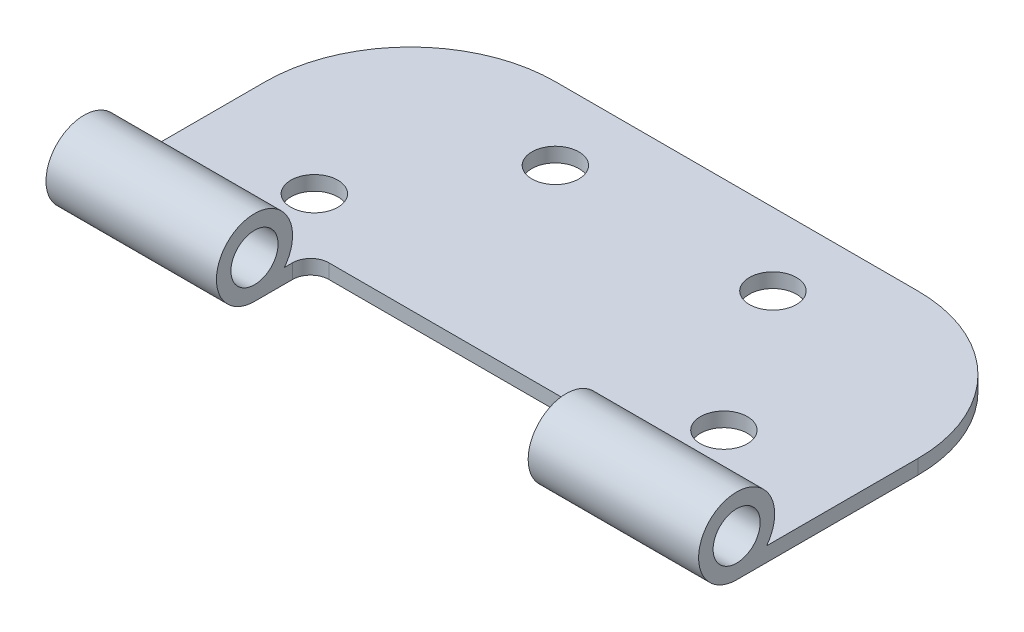
ISO-10303-21;
HEADER;
FILE_DESCRIPTION(('STEP AP214'),'2;1');
FILE_NAME('part.step','',(''),(''),'','','');
FILE_SCHEMA(('AUTOMOTIVE_DESIGN { 1 0 10303 214 1 1 1 1 }'));
ENDSEC;
DATA;
#1=APPLICATION_CONTEXT('core data for automotive mechanical design processes');
#2=APPLICATION_PROTOCOL_DEFINITION('international standard','automotive_design',2000,#1);
#3=PRODUCT_CONTEXT('',#1,'mechanical');
#4=PRODUCT('Part','Part','',(#3));
#5=PRODUCT_RELATED_PRODUCT_CATEGORY('part','',(#4));
#6=PRODUCT_DEFINITION_FORMATION('','',#4);
#7=PRODUCT_DEFINITION_CONTEXT('part definition',#1,'design');
#8=PRODUCT_DEFINITION('design','',#6,#7);
#9=PRODUCT_DEFINITION_SHAPE('','',#8);
#10=(LENGTH_UNIT() NAMED_UNIT(*) SI_UNIT(.MILLI.,.METRE.));
#11=(NAMED_UNIT(*) PLANE_ANGLE_UNIT() SI_UNIT($,.RADIAN.));
#12=(NAMED_UNIT(*) SI_UNIT($,.STERADIAN.) SOLID_ANGLE_UNIT());
#13=UNCERTAINTY_MEASURE_WITH_UNIT(LENGTH_MEASURE(1.E-05),#10,'distance_accuracy_value','');
#14=(GEOMETRIC_REPRESENTATION_CONTEXT(3) GLOBAL_UNCERTAINTY_ASSIGNED_CONTEXT((#13)) GLOBAL_UNIT_ASSIGNED_CONTEXT((#10,
#11,#12)) REPRESENTATION_CONTEXT('',''));
#15=CARTESIAN_POINT('',(0.,0.,0.));
#16=DIRECTION('',(0.,0.,1.));
#17=DIRECTION('',(1.,0.,0.));
#18=AXIS2_PLACEMENT_3D('',#15,#16,#17);
#19=CARTESIAN_POINT('',(-59.8492424049175,5.25,22.5));
#20=DIRECTION('',(1.,0.,0.));
#21=DIRECTION('',(0.,0.,-1.));
#22=AXIS2_PLACEMENT_3D('',#19,#20,#21);
#23=CYLINDRICAL_SURFACE('',#22,5.25);
#24=CARTESIAN_POINT('',(21.495,5.25,22.5));
#25=DIRECTION('',(1.,0.,0.));
#26=DIRECTION('',(0.,0.,-1.));
#27=AXIS2_PLACEMENT_3D('',#24,#25,#26);
#28=CIRCLE('',#27,5.25);
#29=CARTESIAN_POINT('',(21.495,0.,22.5));
#30=VERTEX_POINT('',#29);
#31=CARTESIAN_POINT('',(21.495,2.,18.3768943743823));
#32=VERTEX_POINT('',#31);
#33=EDGE_CURVE('E175',#30,#32,#28,.F.);
#34=ORIENTED_EDGE('',*,*,#33,.F.);
#35=DIRECTION('',(1.,0.,0.));
#36=VECTOR('',#35,1.);
#37=CARTESIAN_POINT('',(-45.,0.,22.5));
#38=LINE('',#37,#36);
#39=CARTESIAN_POINT('',(45.,0.,22.5));
#40=VERTEX_POINT('',#39);
#41=EDGE_CURVE('E159',#30,#40,#38,.T.);
#42=ORIENTED_EDGE('',*,*,#41,.T.);
#43=CARTESIAN_POINT('',(45.,5.25,22.5));
#44=DIRECTION('',(1.,0.,0.));
#45=DIRECTION('',(0.,0.,-1.));
#46=AXIS2_PLACEMENT_3D('',#43,#44,#45);
#47=CIRCLE('',#46,5.25);
#48=CARTESIAN_POINT('',(45.,2.,18.3768943743823));
#49=VERTEX_POINT('',#48);
#50=EDGE_CURVE('E195',#49,#40,#47,.T.);
#51=ORIENTED_EDGE('',*,*,#50,.F.);
#52=DIRECTION('',(1.,0.,0.));
#53=VECTOR('',#52,1.);
#54=CARTESIAN_POINT('',(-59.8492424049175,2.,18.3768943743824));
#55=LINE('',#54,#53);
#56=EDGE_CURVE('E56',#49,#32,#55,.F.);
#57=ORIENTED_EDGE('',*,*,#56,.T.);
#58=EDGE_LOOP('',(#34,#42,#51,#57));
#59=FACE_BOUND('',#58,.T.);
#60=ADVANCED_FACE('F39',(#59),#23,.T.);
#61=CARTESIAN_POINT('',(-59.8492424049175,5.25,22.5));
#62=DIRECTION('',(1.,0.,0.));
#63=DIRECTION('',(0.,0.,-1.));
#64=AXIS2_PLACEMENT_3D('',#61,#62,#63);
#65=CYLINDRICAL_SURFACE('',#64,3.25);
#66=CARTESIAN_POINT('',(-21.495,5.25,22.5));
#67=DIRECTION('',(-1.,0.,0.));
#68=DIRECTION('',(0.,0.,1.));
#69=AXIS2_PLACEMENT_3D('',#66,#67,#68);
#70=CIRCLE('',#69,3.25);
#71=CARTESIAN_POINT('',(-21.495,5.25,25.75));
#72=VERTEX_POINT('',#71);
#73=EDGE_CURVE('E43',#72,#72,#70,.F.);
#74=ORIENTED_EDGE('',*,*,#73,.T.);
#75=EDGE_LOOP('',(#74));
#76=FACE_BOUND('',#75,.T.);
#77=CARTESIAN_POINT('',(-45.,5.25,22.5));
#78=DIRECTION('',(1.,0.,0.));
#79=DIRECTION('',(0.,0.,-1.));
#80=AXIS2_PLACEMENT_3D('',#77,#78,#79);
#81=CIRCLE('',#80,3.25);
#82=CARTESIAN_POINT('',(-45.,5.25,19.25));
#83=VERTEX_POINT('',#82);
#84=EDGE_CURVE('E192',#83,#83,#81,.F.);
#85=ORIENTED_EDGE('',*,*,#84,.T.);
#86=EDGE_LOOP('',(#85));
#87=FACE_BOUND('',#86,.T.);
#88=ADVANCED_FACE('F277',(#76,#87),#65,.F.);
#89=CARTESIAN_POINT('',(-25.,2.,-2.50000000000001));
#90=DIRECTION('',(0.,1.,0.));
#91=DIRECTION('',(0.,0.,1.));
#92=AXIS2_PLACEMENT_3D('',#89,#90,#91);
#93=PLANE('',#92);
#94=DIRECTION('',(0.,0.,1.));
#95=VECTOR('',#94,1.);
#96=CARTESIAN_POINT('',(-21.495,2.,-2.50000000000001));
#97=LINE('',#96,#95);
#98=CARTESIAN_POINT('',(-21.495,2.,17.25));
#99=VERTEX_POINT('',#98);
#100=CARTESIAN_POINT('',(-21.495,2.,18.3768943743824));
#101=VERTEX_POINT('',#100);
#102=EDGE_CURVE('E180',#99,#101,#97,.T.);
#103=ORIENTED_EDGE('',*,*,#102,.F.);
#104=CARTESIAN_POINT('',(-18.995,2.,17.25));
#105=DIRECTION('',(0.,1.,0.));
#106=DIRECTION('',(0.,0.,1.));
#107=AXIS2_PLACEMENT_3D('',#104,#105,#106);
#108=CIRCLE('',#107,2.5);
#109=CARTESIAN_POINT('',(-18.995,2.,14.75));
#110=VERTEX_POINT('',#109);
#111=EDGE_CURVE('E184',#110,#99,#108,.T.);
#112=ORIENTED_EDGE('',*,*,#111,.F.);
#113=DIRECTION('',(-1.,0.,0.));
#114=VECTOR('',#113,1.);
#115=CARTESIAN_POINT('',(-25.,2.,14.75));
#116=LINE('',#115,#114);
#117=CARTESIAN_POINT('',(18.995,2.,14.75));
#118=VERTEX_POINT('',#117);
#119=EDGE_CURVE('E186',#118,#110,#116,.T.);
#120=ORIENTED_EDGE('',*,*,#119,.F.);
#121=CARTESIAN_POINT('',(18.995,2.,17.25));
#122=DIRECTION('',(0.,1.,0.));
#123=DIRECTION('',(0.,0.,1.));
#124=AXIS2_PLACEMENT_3D('',#121,#122,#123);
#125=CIRCLE('',#124,2.5);
#126=CARTESIAN_POINT('',(21.495,2.,17.25));
#127=VERTEX_POINT('',#126);
#128=EDGE_CURVE('E182',#127,#118,#125,.T.);
#129=ORIENTED_EDGE('',*,*,#128,.F.);
#130=DIRECTION('',(0.,0.,-1.));
#131=VECTOR('',#130,1.);
#132=CARTESIAN_POINT('',(21.495,2.,-2.5));
#133=LINE('',#132,#131);
#134=EDGE_CURVE('E140',#32,#127,#133,.T.);
#135=ORIENTED_EDGE('',*,*,#134,.F.);
#136=ORIENTED_EDGE('',*,*,#56,.F.);
#137=DIRECTION('',(0.,0.,-1.));
#138=VECTOR('',#137,1.);
#139=CARTESIAN_POINT('',(45.,2.,-2.49999999999986));
#140=LINE('',#139,#138);
#141=CARTESIAN_POINT('',(45.,2.,-2.49999999999986));
#142=VERTEX_POINT('',#141);
#143=EDGE_CURVE('E226',#49,#142,#140,.T.);
#144=ORIENTED_EDGE('',*,*,#143,.T.);
#145=CARTESIAN_POINT('',(25.,2.,-2.5));
#146=DIRECTION('',(0.,1.,0.));
#147=DIRECTION('',(0.,0.,1.));
#148=AXIS2_PLACEMENT_3D('',#145,#146,#147);
#149=CIRCLE('',#148,20.);
#150=CARTESIAN_POINT('',(24.9999999999999,2.,-22.5));
#151=VERTEX_POINT('',#150);
#152=EDGE_CURVE('E228',#142,#151,#149,.T.);
#153=ORIENTED_EDGE('',*,*,#152,.T.);
#154=DIRECTION('',(-1.,0.,0.));
#155=VECTOR('',#154,1.);
#156=CARTESIAN_POINT('',(-24.9999999999999,2.,-22.5));
#157=LINE('',#156,#155);
#158=CARTESIAN_POINT('',(-24.9999999999999,2.,-22.5));
#159=VERTEX_POINT('',#158);
#160=EDGE_CURVE('E231',#151,#159,#157,.T.);
#161=ORIENTED_EDGE('',*,*,#160,.T.);
#162=CARTESIAN_POINT('',(-25.,2.,-2.50000000000001));
#163=DIRECTION('',(0.,1.,0.));
#164=DIRECTION('',(0.,0.,1.));
#165=AXIS2_PLACEMENT_3D('',#162,#163,#164);
#166=CIRCLE('',#165,20.);
#167=CARTESIAN_POINT('',(-45.,2.,-2.49999999999986));
#168=VERTEX_POINT('',#167);
#169=EDGE_CURVE('E233',#159,#168,#166,.T.);
#170=ORIENTED_EDGE('',*,*,#169,.T.);
#171=DIRECTION('',(0.,0.,1.));
#172=VECTOR('',#171,1.);
#173=CARTESIAN_POINT('',(-45.,2.,-2.49999999999986));
#174=LINE('',#173,#172);
#175=CARTESIAN_POINT('',(-45.,2.,18.3768943743824));
#176=VERTEX_POINT('',#175);
#177=EDGE_CURVE('E235',#168,#176,#174,.T.);
#178=ORIENTED_EDGE('',*,*,#177,.T.);
#179=EDGE_CURVE('E64',#101,#176,#55,.F.);
#180=ORIENTED_EDGE('',*,*,#179,.F.);
#181=EDGE_LOOP('',(#103,#112,#120,#129,#135,#136,#144,#153,#161,#170,#178,#180));
#182=FACE_BOUND('',#181,.T.);
#183=CARTESIAN_POINT('',(15.,2.,-12.5));
#184=DIRECTION('',(0.,1.,0.));
#185=DIRECTION('',(0.,0.,-1.));
#186=AXIS2_PLACEMENT_3D('',#183,#184,#185);
#187=CIRCLE('',#186,3.24);
#188=CARTESIAN_POINT('',(15.,2.,-15.74));
#189=VERTEX_POINT('',#188);
#190=EDGE_CURVE('E208',#189,#189,#187,.T.);
#191=ORIENTED_EDGE('',*,*,#190,.F.);
#192=EDGE_LOOP('',(#191));
#193=FACE_BOUND('',#192,.T.);
#194=CARTESIAN_POINT('',(-28.24,2.,7.5));
#195=DIRECTION('',(0.,1.,0.));
#196=DIRECTION('',(0.,0.,1.));
#197=AXIS2_PLACEMENT_3D('',#194,#195,#196);
#198=CIRCLE('',#197,3.24);
#199=CARTESIAN_POINT('',(-28.24,2.,10.74));
#200=VERTEX_POINT('',#199);
#201=EDGE_CURVE('E220',#200,#200,#198,.T.);
#202=ORIENTED_EDGE('',*,*,#201,.F.);
#203=EDGE_LOOP('',(#202));
#204=FACE_BOUND('',#203,.T.);
#205=CARTESIAN_POINT('',(-15.,2.,-12.5));
#206=DIRECTION('',(0.,1.,0.));
#207=DIRECTION('',(0.,0.,1.));
#208=AXIS2_PLACEMENT_3D('',#205,#206,#207);
#209=CIRCLE('',#208,3.24);
#210=CARTESIAN_POINT('',(-15.,2.,-9.26));
#211=VERTEX_POINT('',#210);
#212=EDGE_CURVE('E214',#211,#211,#209,.T.);
#213=ORIENTED_EDGE('',*,*,#212,.F.);
#214=EDGE_LOOP('',(#213));
#215=FACE_BOUND('',#214,.T.);
#216=CARTESIAN_POINT('',(28.24,2.,7.49999999999999));
#217=DIRECTION('',(0.,1.,0.));
#218=DIRECTION('',(0.,0.,-1.));
#219=AXIS2_PLACEMENT_3D('',#216,#217,#218);
#220=CIRCLE('',#219,3.24);
#221=CARTESIAN_POINT('',(28.24,2.,4.25999999999999));
#222=VERTEX_POINT('',#221);
#223=EDGE_CURVE('E202',#222,#222,#220,.T.);
#224=ORIENTED_EDGE('',*,*,#223,.F.);
#225=EDGE_LOOP('',(#224));
#226=FACE_BOUND('',#225,.T.);
#227=ADVANCED_FACE('F285',(#182,#193,#204,#215,#226),#93,.T.);
#228=CARTESIAN_POINT('',(-25.,0.,-2.50000000000001));
#229=DIRECTION('',(0.,1.,0.));
#230=DIRECTION('',(0.,0.,1.));
#231=AXIS2_PLACEMENT_3D('',#228,#229,#230);
#232=PLANE('',#231);
#233=CARTESIAN_POINT('',(-18.995,0.,17.25));
#234=DIRECTION('',(0.,1.,0.));
#235=DIRECTION('',(0.,0.,-1.));
#236=AXIS2_PLACEMENT_3D('',#233,#234,#235);
#237=CIRCLE('',#236,2.5);
#238=CARTESIAN_POINT('',(-18.995,0.,14.75));
#239=VERTEX_POINT('',#238);
#240=CARTESIAN_POINT('',(-21.495,0.,17.25));
#241=VERTEX_POINT('',#240);
#242=EDGE_CURVE('E144',#239,#241,#237,.T.);
#243=ORIENTED_EDGE('',*,*,#242,.T.);
#244=DIRECTION('',(0.,0.,1.));
#245=VECTOR('',#244,1.);
#246=CARTESIAN_POINT('',(-21.495,0.,40.75));
#247=LINE('',#246,#245);
#248=CARTESIAN_POINT('',(-21.495,0.,22.5));
#249=VERTEX_POINT('',#248);
#250=EDGE_CURVE('E160',#241,#249,#247,.T.);
#251=ORIENTED_EDGE('',*,*,#250,.T.);
#252=CARTESIAN_POINT('',(-45.,0.,22.5));
#253=VERTEX_POINT('',#252);
#254=EDGE_CURVE('E229',#253,#249,#38,.T.);
#255=ORIENTED_EDGE('',*,*,#254,.F.);
#256=DIRECTION('',(0.,0.,1.));
#257=VECTOR('',#256,1.);
#258=CARTESIAN_POINT('',(-45.,0.,-2.49999999999986));
#259=LINE('',#258,#257);
#260=CARTESIAN_POINT('',(-45.,0.,-2.49999999999986));
#261=VERTEX_POINT('',#260);
#262=EDGE_CURVE('E246',#261,#253,#259,.T.);
#263=ORIENTED_EDGE('',*,*,#262,.F.);
#264=CARTESIAN_POINT('',(-25.,0.,-2.50000000000001));
#265=DIRECTION('',(0.,1.,0.));
#266=DIRECTION('',(0.,0.,1.));
#267=AXIS2_PLACEMENT_3D('',#264,#265,#266);
#268=CIRCLE('',#267,20.);
#269=CARTESIAN_POINT('',(-24.9999999999999,0.,-22.5));
#270=VERTEX_POINT('',#269);
#271=EDGE_CURVE('E244',#270,#261,#268,.T.);
#272=ORIENTED_EDGE('',*,*,#271,.F.);
#273=DIRECTION('',(-1.,0.,0.));
#274=VECTOR('',#273,1.);
#275=CARTESIAN_POINT('',(-24.9999999999999,0.,-22.5));
#276=LINE('',#275,#274);
#277=CARTESIAN_POINT('',(24.9999999999999,0.,-22.5));
#278=VERTEX_POINT('',#277);
#279=EDGE_CURVE('E242',#278,#270,#276,.T.);
#280=ORIENTED_EDGE('',*,*,#279,.F.);
#281=CARTESIAN_POINT('',(25.,0.,-2.5));
#282=DIRECTION('',(0.,1.,0.));
#283=DIRECTION('',(0.,0.,1.));
#284=AXIS2_PLACEMENT_3D('',#281,#282,#283);
#285=CIRCLE('',#284,20.);
#286=CARTESIAN_POINT('',(45.,0.,-2.49999999999986));
#287=VERTEX_POINT('',#286);
#288=EDGE_CURVE('E240',#287,#278,#285,.T.);
#289=ORIENTED_EDGE('',*,*,#288,.F.);
#290=DIRECTION('',(0.,0.,-1.));
#291=VECTOR('',#290,1.);
#292=CARTESIAN_POINT('',(45.,0.,-2.49999999999986));
#293=LINE('',#292,#291);
#294=EDGE_CURVE('E223',#40,#287,#293,.T.);
#295=ORIENTED_EDGE('',*,*,#294,.F.);
#296=ORIENTED_EDGE('',*,*,#41,.F.);
#297=DIRECTION('',(0.,0.,-1.));
#298=VECTOR('',#297,1.);
#299=CARTESIAN_POINT('',(21.495,0.,40.75));
#300=LINE('',#299,#298);
#301=CARTESIAN_POINT('',(21.495,0.,17.25));
#302=VERTEX_POINT('',#301);
#303=EDGE_CURVE('E138',#30,#302,#300,.T.);
#304=ORIENTED_EDGE('',*,*,#303,.T.);
#305=CARTESIAN_POINT('',(18.995,0.,17.25));
#306=DIRECTION('',(0.,1.,0.));
#307=DIRECTION('',(0.,0.,1.));
#308=AXIS2_PLACEMENT_3D('',#305,#306,#307);
#309=CIRCLE('',#308,2.5);
#310=CARTESIAN_POINT('',(18.995,0.,14.75));
#311=VERTEX_POINT('',#310);
#312=EDGE_CURVE('E147',#302,#311,#309,.T.);
#313=ORIENTED_EDGE('',*,*,#312,.T.);
#314=DIRECTION('',(-1.,0.,0.));
#315=VECTOR('',#314,1.);
#316=CARTESIAN_POINT('',(-18.995,0.,14.75));
#317=LINE('',#316,#315);
#318=EDGE_CURVE('E153',#311,#239,#317,.T.);
#319=ORIENTED_EDGE('',*,*,#318,.T.);
#320=EDGE_LOOP('',(#243,#251,#255,#263,#272,#280,#289,#295,#296,#304,#313,#319));
#321=FACE_BOUND('',#320,.T.);
#322=CARTESIAN_POINT('',(-28.24,0.,7.5));
#323=DIRECTION('',(0.,1.,0.));
#324=DIRECTION('',(0.,0.,1.));
#325=AXIS2_PLACEMENT_3D('',#322,#323,#324);
#326=CIRCLE('',#325,3.24);
#327=CARTESIAN_POINT('',(-28.24,0.,10.74));
#328=VERTEX_POINT('',#327);
#329=EDGE_CURVE('E217',#328,#328,#326,.T.);
#330=ORIENTED_EDGE('',*,*,#329,.T.);
#331=EDGE_LOOP('',(#330));
#332=FACE_BOUND('',#331,.T.);
#333=CARTESIAN_POINT('',(-15.,0.,-12.5));
#334=DIRECTION('',(0.,1.,0.));
#335=DIRECTION('',(0.,0.,1.));
#336=AXIS2_PLACEMENT_3D('',#333,#334,#335);
#337=CIRCLE('',#336,3.24);
#338=CARTESIAN_POINT('',(-15.,0.,-9.26));
#339=VERTEX_POINT('',#338);
#340=EDGE_CURVE('E211',#339,#339,#337,.T.);
#341=ORIENTED_EDGE('',*,*,#340,.T.);
#342=EDGE_LOOP('',(#341));
#343=FACE_BOUND('',#342,.T.);
#344=CARTESIAN_POINT('',(15.,0.,-12.5));
#345=DIRECTION('',(0.,1.,0.));
#346=DIRECTION('',(0.,0.,-1.));
#347=AXIS2_PLACEMENT_3D('',#344,#345,#346);
#348=CIRCLE('',#347,3.24);
#349=CARTESIAN_POINT('',(15.,0.,-15.74));
#350=VERTEX_POINT('',#349);
#351=EDGE_CURVE('E205',#350,#350,#348,.T.);
#352=ORIENTED_EDGE('',*,*,#351,.T.);
#353=EDGE_LOOP('',(#352));
#354=FACE_BOUND('',#353,.T.);
#355=CARTESIAN_POINT('',(28.24,0.,7.49999999999999));
#356=DIRECTION('',(0.,1.,0.));
#357=DIRECTION('',(0.,0.,-1.));
#358=AXIS2_PLACEMENT_3D('',#355,#356,#357);
#359=CIRCLE('',#358,3.24);
#360=CARTESIAN_POINT('',(28.24,0.,4.25999999999999));
#361=VERTEX_POINT('',#360);
#362=EDGE_CURVE('E201',#361,#361,#359,.T.);
#363=ORIENTED_EDGE('',*,*,#362,.T.);
#364=EDGE_LOOP('',(#363));
#365=FACE_BOUND('',#364,.T.);
#366=ADVANCED_FACE('F156',(#321,#332,#343,#354,#365),#232,.F.);
#367=CARTESIAN_POINT('',(45.,2.,-2.49999999999986));
#368=DIRECTION('',(-1.,0.,0.));
#369=DIRECTION('',(0.,0.,1.));
#370=AXIS2_PLACEMENT_3D('',#367,#368,#369);
#371=PLANE('',#370);
#372=ORIENTED_EDGE('',*,*,#143,.F.);
#373=ORIENTED_EDGE('',*,*,#50,.T.);
#374=ORIENTED_EDGE('',*,*,#294,.T.);
#375=DIRECTION('',(0.,-1.,0.));
#376=VECTOR('',#375,1.);
#377=CARTESIAN_POINT('',(45.,2.,-2.49999999999986));
#378=LINE('',#377,#376);
#379=EDGE_CURVE('E11',#142,#287,#378,.T.);
#380=ORIENTED_EDGE('',*,*,#379,.F.);
#381=EDGE_LOOP('',(#372,#373,#374,#380));
#382=FACE_BOUND('',#381,.T.);
#383=CARTESIAN_POINT('',(45.,5.25,22.5));
#384=DIRECTION('',(1.,0.,0.));
#385=DIRECTION('',(0.,0.,-1.));
#386=AXIS2_PLACEMENT_3D('',#383,#384,#385);
#387=CIRCLE('',#386,3.25);
#388=CARTESIAN_POINT('',(45.,5.25,19.25));
#389=VERTEX_POINT('',#388);
#390=EDGE_CURVE('E188',#389,#389,#387,.T.);
#391=ORIENTED_EDGE('',*,*,#390,.F.);
#392=EDGE_LOOP('',(#391));
#393=FACE_BOUND('',#392,.T.);
#394=ADVANCED_FACE('F41',(#382,#393),#371,.F.);
#395=CARTESIAN_POINT('',(25.,2.,-2.5));
#396=DIRECTION('',(0.,-1.,0.));
#397=DIRECTION('',(0.,0.,-1.));
#398=AXIS2_PLACEMENT_3D('',#395,#396,#397);
#399=CYLINDRICAL_SURFACE('',#398,20.);
#400=ORIENTED_EDGE('',*,*,#288,.T.);
#401=DIRECTION('',(0.,-1.,0.));
#402=VECTOR('',#401,1.);
#403=CARTESIAN_POINT('',(24.9999999999999,2.,-22.5));
#404=LINE('',#403,#402);
#405=EDGE_CURVE('E48',#151,#278,#404,.T.);
#406=ORIENTED_EDGE('',*,*,#405,.F.);
#407=ORIENTED_EDGE('',*,*,#152,.F.);
#408=ORIENTED_EDGE('',*,*,#379,.T.);
#409=EDGE_LOOP('',(#400,#406,#407,#408));
#410=FACE_BOUND('',#409,.T.);
#411=ADVANCED_FACE('F385',(#410),#399,.T.);
#412=CARTESIAN_POINT('',(-24.9999999999999,2.,-22.5));
#413=DIRECTION('',(0.,0.,1.));
#414=DIRECTION('',(1.,0.,0.));
#415=AXIS2_PLACEMENT_3D('',#412,#413,#414);
#416=PLANE('',#415);
#417=ORIENTED_EDGE('',*,*,#279,.T.);
#418=DIRECTION('',(0.,-1.,0.));
#419=VECTOR('',#418,1.);
#420=CARTESIAN_POINT('',(-24.9999999999999,2.,-22.5));
#421=LINE('',#420,#419);
#422=EDGE_CURVE('E253',#159,#270,#421,.T.);
#423=ORIENTED_EDGE('',*,*,#422,.F.);
#424=ORIENTED_EDGE('',*,*,#160,.F.);
#425=ORIENTED_EDGE('',*,*,#405,.T.);
#426=EDGE_LOOP('',(#417,#423,#424,#425));
#427=FACE_BOUND('',#426,.T.);
#428=ADVANCED_FACE('F427',(#427),#416,.F.);
#429=CARTESIAN_POINT('',(-25.,2.,-2.50000000000001));
#430=DIRECTION('',(0.,-1.,0.));
#431=DIRECTION('',(0.,0.,-1.));
#432=AXIS2_PLACEMENT_3D('',#429,#430,#431);
#433=CYLINDRICAL_SURFACE('',#432,20.);
#434=ORIENTED_EDGE('',*,*,#271,.T.);
#435=DIRECTION('',(0.,-1.,0.));
#436=VECTOR('',#435,1.);
#437=CARTESIAN_POINT('',(-45.,2.,-2.49999999999986));
#438=LINE('',#437,#436);
#439=EDGE_CURVE('E237',#168,#261,#438,.T.);
#440=ORIENTED_EDGE('',*,*,#439,.F.);
#441=ORIENTED_EDGE('',*,*,#169,.F.);
#442=ORIENTED_EDGE('',*,*,#422,.T.);
#443=EDGE_LOOP('',(#434,#440,#441,#442));
#444=FACE_BOUND('',#443,.T.);
#445=ADVANCED_FACE('F372',(#444),#433,.T.);
#446=CARTESIAN_POINT('',(-45.,2.,-2.49999999999986));
#447=DIRECTION('',(1.,0.,0.));
#448=DIRECTION('',(0.,0.,-1.));
#449=AXIS2_PLACEMENT_3D('',#446,#447,#448);
#450=PLANE('',#449);
#451=CARTESIAN_POINT('',(-45.,5.25,22.5));
#452=DIRECTION('',(1.,0.,0.));
#453=DIRECTION('',(0.,0.,-1.));
#454=AXIS2_PLACEMENT_3D('',#451,#452,#453);
#455=CIRCLE('',#454,5.25);
#456=EDGE_CURVE('E189',#253,#176,#455,.F.);
#457=ORIENTED_EDGE('',*,*,#456,.T.);
#458=ORIENTED_EDGE('',*,*,#177,.F.);
#459=ORIENTED_EDGE('',*,*,#439,.T.);
#460=ORIENTED_EDGE('',*,*,#262,.T.);
#461=EDGE_LOOP('',(#457,#458,#459,#460));
#462=FACE_BOUND('',#461,.T.);
#463=ORIENTED_EDGE('',*,*,#84,.F.);
#464=EDGE_LOOP('',(#463));
#465=FACE_BOUND('',#464,.T.);
#466=ADVANCED_FACE('F306',(#462,#465),#450,.F.);
#467=CARTESIAN_POINT('',(-28.24,2.,7.5));
#468=DIRECTION('',(0.,-1.,0.));
#469=DIRECTION('',(0.,0.,-1.));
#470=AXIS2_PLACEMENT_3D('',#467,#468,#469);
#471=CYLINDRICAL_SURFACE('',#470,3.24);
#472=ORIENTED_EDGE('',*,*,#201,.T.);
#473=EDGE_LOOP('',(#472));
#474=FACE_BOUND('',#473,.T.);
#475=ORIENTED_EDGE('',*,*,#329,.F.);
#476=EDGE_LOOP('',(#475));
#477=FACE_BOUND('',#476,.T.);
#478=ADVANCED_FACE('F371',(#474,#477),#471,.F.);
#479=CARTESIAN_POINT('',(-15.,2.,-12.5));
#480=DIRECTION('',(0.,-1.,0.));
#481=DIRECTION('',(0.,0.,-1.));
#482=AXIS2_PLACEMENT_3D('',#479,#480,#481);
#483=CYLINDRICAL_SURFACE('',#482,3.24);
#484=ORIENTED_EDGE('',*,*,#212,.T.);
#485=EDGE_LOOP('',(#484));
#486=FACE_BOUND('',#485,.T.);
#487=ORIENTED_EDGE('',*,*,#340,.F.);
#488=EDGE_LOOP('',(#487));
#489=FACE_BOUND('',#488,.T.);
#490=ADVANCED_FACE('F403',(#486,#489),#483,.F.);
#491=CARTESIAN_POINT('',(15.,2.,-12.5));
#492=DIRECTION('',(0.,-1.,0.));
#493=DIRECTION('',(0.,0.,-1.));
#494=AXIS2_PLACEMENT_3D('',#491,#492,#493);
#495=CYLINDRICAL_SURFACE('',#494,3.24);
#496=ORIENTED_EDGE('',*,*,#190,.T.);
#497=EDGE_LOOP('',(#496));
#498=FACE_BOUND('',#497,.T.);
#499=ORIENTED_EDGE('',*,*,#351,.F.);
#500=EDGE_LOOP('',(#499));
#501=FACE_BOUND('',#500,.T.);
#502=ADVANCED_FACE('F296',(#498,#501),#495,.F.);
#503=CARTESIAN_POINT('',(28.24,2.,7.49999999999999));
#504=DIRECTION('',(0.,-1.,0.));
#505=DIRECTION('',(0.,0.,-1.));
#506=AXIS2_PLACEMENT_3D('',#503,#504,#505);
#507=CYLINDRICAL_SURFACE('',#506,3.24);
#508=ORIENTED_EDGE('',*,*,#223,.T.);
#509=EDGE_LOOP('',(#508));
#510=FACE_BOUND('',#509,.T.);
#511=ORIENTED_EDGE('',*,*,#362,.F.);
#512=EDGE_LOOP('',(#511));
#513=FACE_BOUND('',#512,.T.);
#514=ADVANCED_FACE('F290',(#510,#513),#507,.F.);
#515=CARTESIAN_POINT('',(-21.495,5.25,22.5));
#516=DIRECTION('',(-1.,0.,0.));
#517=DIRECTION('',(0.,0.,1.));
#518=AXIS2_PLACEMENT_3D('',#515,#516,#517);
#519=CIRCLE('',#518,5.25);
#520=EDGE_CURVE('E178',#101,#249,#519,.F.);
#521=ORIENTED_EDGE('',*,*,#520,.F.);
#522=ORIENTED_EDGE('',*,*,#179,.T.);
#523=ORIENTED_EDGE('',*,*,#456,.F.);
#524=ORIENTED_EDGE('',*,*,#254,.T.);
#525=EDGE_LOOP('',(#521,#522,#523,#524));
#526=FACE_BOUND('',#525,.T.);
#527=ADVANCED_FACE('F280',(#526),#23,.T.);
#528=CARTESIAN_POINT('',(21.495,5.25,22.5));
#529=DIRECTION('',(1.,0.,0.));
#530=DIRECTION('',(0.,0.,-1.));
#531=AXIS2_PLACEMENT_3D('',#528,#529,#530);
#532=CIRCLE('',#531,3.25);
#533=CARTESIAN_POINT('',(21.495,5.25,19.25));
#534=VERTEX_POINT('',#533);
#535=EDGE_CURVE('E170',#534,#534,#532,.F.);
#536=ORIENTED_EDGE('',*,*,#535,.T.);
#537=EDGE_LOOP('',(#536));
#538=FACE_BOUND('',#537,.T.);
#539=ORIENTED_EDGE('',*,*,#390,.T.);
#540=EDGE_LOOP('',(#539));
#541=FACE_BOUND('',#540,.T.);
#542=ADVANCED_FACE('F260',(#538,#541),#65,.F.);
#543=CARTESIAN_POINT('',(-21.495,0.,40.75));
#544=DIRECTION('',(-1.,0.,0.));
#545=DIRECTION('',(0.,0.,1.));
#546=AXIS2_PLACEMENT_3D('',#543,#544,#545);
#547=PLANE('',#546);
#548=ORIENTED_EDGE('',*,*,#102,.T.);
#549=ORIENTED_EDGE('',*,*,#520,.T.);
#550=ORIENTED_EDGE('',*,*,#250,.F.);
#551=DIRECTION('',(0.,1.,0.));
#552=VECTOR('',#551,1.);
#553=CARTESIAN_POINT('',(-21.495,0.,17.25));
#554=LINE('',#553,#552);
#555=EDGE_CURVE('E167',#241,#99,#554,.T.);
#556=ORIENTED_EDGE('',*,*,#555,.T.);
#557=EDGE_LOOP('',(#548,#549,#550,#556));
#558=FACE_BOUND('',#557,.T.);
#559=ORIENTED_EDGE('',*,*,#73,.F.);
#560=EDGE_LOOP('',(#559));
#561=FACE_BOUND('',#560,.T.);
#562=ADVANCED_FACE('F264',(#558,#561),#547,.F.);
#563=CARTESIAN_POINT('',(21.495,0.,40.75));
#564=DIRECTION('',(1.,0.,0.));
#565=DIRECTION('',(0.,0.,-1.));
#566=AXIS2_PLACEMENT_3D('',#563,#564,#565);
#567=PLANE('',#566);
#568=ORIENTED_EDGE('',*,*,#134,.T.);
#569=DIRECTION('',(0.,1.,0.));
#570=VECTOR('',#569,1.);
#571=CARTESIAN_POINT('',(21.495,0.,17.25));
#572=LINE('',#571,#570);
#573=EDGE_CURVE('E133',#302,#127,#572,.T.);
#574=ORIENTED_EDGE('',*,*,#573,.F.);
#575=ORIENTED_EDGE('',*,*,#303,.F.);
#576=ORIENTED_EDGE('',*,*,#33,.T.);
#577=EDGE_LOOP('',(#568,#574,#575,#576));
#578=FACE_BOUND('',#577,.T.);
#579=ORIENTED_EDGE('',*,*,#535,.F.);
#580=EDGE_LOOP('',(#579));
#581=FACE_BOUND('',#580,.T.);
#582=ADVANCED_FACE('F135',(#578,#581),#567,.F.);
#583=CARTESIAN_POINT('',(-18.995,0.,17.25));
#584=DIRECTION('',(0.,1.,0.));
#585=DIRECTION('',(0.,0.,1.));
#586=AXIS2_PLACEMENT_3D('',#583,#584,#585);
#587=CYLINDRICAL_SURFACE('',#586,2.5);
#588=ORIENTED_EDGE('',*,*,#111,.T.);
#589=ORIENTED_EDGE('',*,*,#555,.F.);
#590=ORIENTED_EDGE('',*,*,#242,.F.);
#591=DIRECTION('',(0.,1.,0.));
#592=VECTOR('',#591,1.);
#593=CARTESIAN_POINT('',(-18.995,0.,14.75));
#594=LINE('',#593,#592);
#595=EDGE_CURVE('E171',#239,#110,#594,.T.);
#596=ORIENTED_EDGE('',*,*,#595,.T.);
#597=EDGE_LOOP('',(#588,#589,#590,#596));
#598=FACE_BOUND('',#597,.T.);
#599=ADVANCED_FACE('F263',(#598),#587,.F.);
#600=CARTESIAN_POINT('',(-18.995,0.,14.75));
#601=DIRECTION('',(0.,0.,-1.));
#602=DIRECTION('',(-1.,0.,0.));
#603=AXIS2_PLACEMENT_3D('',#600,#601,#602);
#604=PLANE('',#603);
#605=ORIENTED_EDGE('',*,*,#119,.T.);
#606=ORIENTED_EDGE('',*,*,#595,.F.);
#607=ORIENTED_EDGE('',*,*,#318,.F.);
#608=DIRECTION('',(0.,1.,0.));
#609=VECTOR('',#608,1.);
#610=CARTESIAN_POINT('',(18.995,0.,14.75));
#611=LINE('',#610,#609);
#612=EDGE_CURVE('E143',#311,#118,#611,.T.);
#613=ORIENTED_EDGE('',*,*,#612,.T.);
#614=EDGE_LOOP('',(#605,#606,#607,#613));
#615=FACE_BOUND('',#614,.T.);
#616=ADVANCED_FACE('F270',(#615),#604,.F.);
#617=CARTESIAN_POINT('',(18.995,0.,17.25));
#618=DIRECTION('',(0.,1.,0.));
#619=DIRECTION('',(0.,0.,1.));
#620=AXIS2_PLACEMENT_3D('',#617,#618,#619);
#621=CYLINDRICAL_SURFACE('',#620,2.5);
#622=ORIENTED_EDGE('',*,*,#128,.T.);
#623=ORIENTED_EDGE('',*,*,#612,.F.);
#624=ORIENTED_EDGE('',*,*,#312,.F.);
#625=ORIENTED_EDGE('',*,*,#573,.T.);
#626=EDGE_LOOP('',(#622,#623,#624,#625));
#627=FACE_BOUND('',#626,.T.);
#628=ADVANCED_FACE('F148',(#627),#621,.F.);
#629=CLOSED_SHELL('',(#60,#88,#227,#366,#394,#411,#428,#445,#466,#478,#490,#502,#514,#527,#542,
#562,#582,#599,#616,#628));
#630=MANIFOLD_SOLID_BREP('B2',#629);
#631=ADVANCED_BREP_SHAPE_REPRESENTATION('',(#18,#630),#14);
#632=SHAPE_DEFINITION_REPRESENTATION(#9,#631);
ENDSEC;
END-ISO-10303-21;
